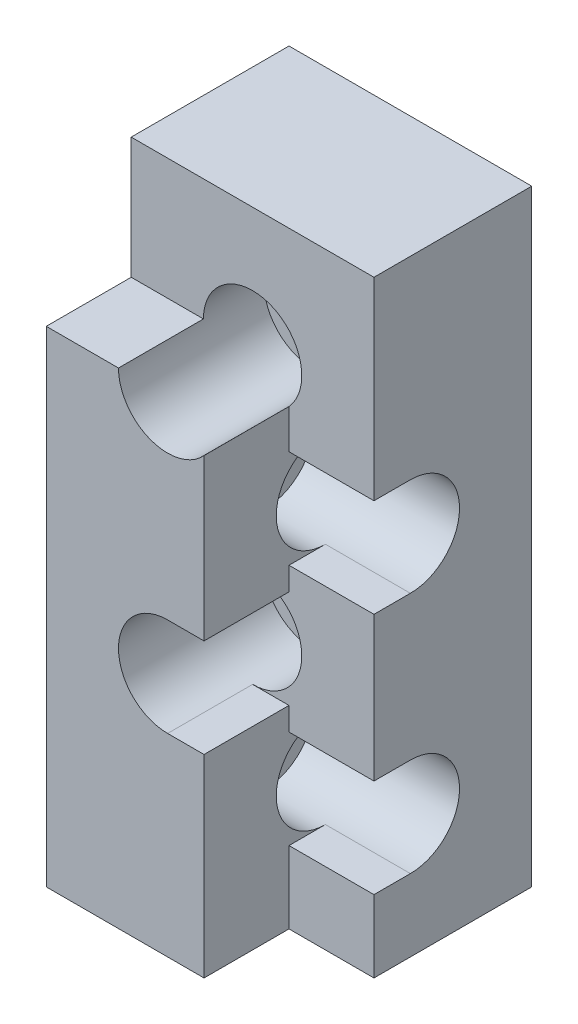
ISO-10303-21;
HEADER;
FILE_DESCRIPTION(('STEP AP214'),'2;1');
FILE_NAME('part.step','',(''),(''),'','','');
FILE_SCHEMA(('AUTOMOTIVE_DESIGN { 1 0 10303 214 1 1 1 1 }'));
ENDSEC;
DATA;
#1=APPLICATION_CONTEXT('core data for automotive mechanical design processes');
#2=APPLICATION_PROTOCOL_DEFINITION('international standard','automotive_design',2000,#1);
#3=PRODUCT_CONTEXT('',#1,'mechanical');
#4=PRODUCT('Part','Part','',(#3));
#5=PRODUCT_RELATED_PRODUCT_CATEGORY('part','',(#4));
#6=PRODUCT_DEFINITION_FORMATION('','',#4);
#7=PRODUCT_DEFINITION_CONTEXT('part definition',#1,'design');
#8=PRODUCT_DEFINITION('design','',#6,#7);
#9=PRODUCT_DEFINITION_SHAPE('','',#8);
#10=(LENGTH_UNIT() NAMED_UNIT(*) SI_UNIT(.MILLI.,.METRE.));
#11=(NAMED_UNIT(*) PLANE_ANGLE_UNIT() SI_UNIT($,.RADIAN.));
#12=(NAMED_UNIT(*) SI_UNIT($,.STERADIAN.) SOLID_ANGLE_UNIT());
#13=UNCERTAINTY_MEASURE_WITH_UNIT(LENGTH_MEASURE(1.E-05),#10,'distance_accuracy_value','');
#14=(GEOMETRIC_REPRESENTATION_CONTEXT(3) GLOBAL_UNCERTAINTY_ASSIGNED_CONTEXT((#13)) GLOBAL_UNIT_ASSIGNED_CONTEXT((#10,
#11,#12)) REPRESENTATION_CONTEXT('',''));
#15=CARTESIAN_POINT('',(0.,0.,0.));
#16=DIRECTION('',(0.,0.,1.));
#17=DIRECTION('',(1.,0.,0.));
#18=AXIS2_PLACEMENT_3D('',#15,#16,#17);
#19=CARTESIAN_POINT('',(20.,30.,-10.));
#20=DIRECTION('',(-1.,0.,0.));
#21=DIRECTION('',(0.,0.,1.));
#22=AXIS2_PLACEMENT_3D('',#19,#20,#21);
#23=CYLINDRICAL_SURFACE('',#22,4.05);
#24=CARTESIAN_POINT('',(8.,30.,-10.));
#25=DIRECTION('',(1.,0.,0.));
#26=DIRECTION('',(0.,0.,-1.));
#27=AXIS2_PLACEMENT_3D('',#24,#25,#26);
#28=CIRCLE('',#27,4.05);
#29=CARTESIAN_POINT('',(8.,30.,-14.05));
#30=VERTEX_POINT('',#29);
#31=EDGE_CURVE('E217',#30,#30,#28,.T.);
#32=ORIENTED_EDGE('',*,*,#31,.F.);
#33=EDGE_LOOP('',(#32));
#34=FACE_BOUND('',#33,.T.);
#35=CARTESIAN_POINT('',(20.,30.,-10.));
#36=DIRECTION('',(-1.,0.,0.));
#37=DIRECTION('',(0.,0.,1.));
#38=AXIS2_PLACEMENT_3D('',#35,#36,#37);
#39=CIRCLE('',#38,4.05);
#40=CARTESIAN_POINT('',(20.,25.95,-10.));
#41=VERTEX_POINT('',#40);
#42=CARTESIAN_POINT('',(20.,34.05,-10.));
#43=VERTEX_POINT('',#42);
#44=EDGE_CURVE('E11',#41,#43,#39,.F.);
#45=ORIENTED_EDGE('',*,*,#44,.T.);
#46=DIRECTION('',(1.,0.,0.));
#47=VECTOR('',#46,1.);
#48=CARTESIAN_POINT('',(13.,34.05,-10.));
#49=LINE('',#48,#47);
#50=CARTESIAN_POINT('',(13.,34.05,-10.));
#51=VERTEX_POINT('',#50);
#52=EDGE_CURVE('E448',#51,#43,#49,.T.);
#53=ORIENTED_EDGE('',*,*,#52,.F.);
#54=CARTESIAN_POINT('',(13.,30.,-10.));
#55=DIRECTION('',(-1.,0.,0.));
#56=DIRECTION('',(0.,0.,1.));
#57=AXIS2_PLACEMENT_3D('',#54,#55,#56);
#58=CIRCLE('',#57,4.05);
#59=CARTESIAN_POINT('',(13.,25.95,-10.));
#60=VERTEX_POINT('',#59);
#61=EDGE_CURVE('E63',#51,#60,#58,.F.);
#62=ORIENTED_EDGE('',*,*,#61,.T.);
#63=DIRECTION('',(1.,0.,0.));
#64=VECTOR('',#63,1.);
#65=CARTESIAN_POINT('',(13.,25.95,-10.));
#66=LINE('',#65,#64);
#67=EDGE_CURVE('E460',#60,#41,#66,.T.);
#68=ORIENTED_EDGE('',*,*,#67,.T.);
#69=EDGE_LOOP('',(#45,#53,#62,#68));
#70=FACE_BOUND('',#69,.T.);
#71=ADVANCED_FACE('F37',(#34,#70),#23,.F.);
#72=CARTESIAN_POINT('',(20.,10.,-10.));
#73=DIRECTION('',(-1.,0.,0.));
#74=DIRECTION('',(0.,0.,1.));
#75=AXIS2_PLACEMENT_3D('',#72,#73,#74);
#76=CYLINDRICAL_SURFACE('',#75,4.05);
#77=CARTESIAN_POINT('',(8.,10.,-10.));
#78=DIRECTION('',(1.,0.,0.));
#79=DIRECTION('',(0.,0.,-1.));
#80=AXIS2_PLACEMENT_3D('',#77,#78,#79);
#81=CIRCLE('',#80,4.05);
#82=CARTESIAN_POINT('',(8.,10.,-14.05));
#83=VERTEX_POINT('',#82);
#84=EDGE_CURVE('E245',#83,#83,#81,.T.);
#85=ORIENTED_EDGE('',*,*,#84,.F.);
#86=EDGE_LOOP('',(#85));
#87=FACE_BOUND('',#86,.T.);
#88=CARTESIAN_POINT('',(20.,10.,-10.));
#89=DIRECTION('',(-1.,0.,0.));
#90=DIRECTION('',(0.,0.,1.));
#91=AXIS2_PLACEMENT_3D('',#88,#89,#90);
#92=CIRCLE('',#91,4.05);
#93=CARTESIAN_POINT('',(20.,5.95,-10.));
#94=VERTEX_POINT('',#93);
#95=CARTESIAN_POINT('',(20.,14.05,-10.));
#96=VERTEX_POINT('',#95);
#97=EDGE_CURVE('E47',#94,#96,#92,.F.);
#98=ORIENTED_EDGE('',*,*,#97,.T.);
#99=DIRECTION('',(1.,0.,0.));
#100=VECTOR('',#99,1.);
#101=CARTESIAN_POINT('',(13.,14.05,-10.));
#102=LINE('',#101,#100);
#103=CARTESIAN_POINT('',(13.,14.05,-10.));
#104=VERTEX_POINT('',#103);
#105=EDGE_CURVE('E443',#104,#96,#102,.T.);
#106=ORIENTED_EDGE('',*,*,#105,.F.);
#107=CARTESIAN_POINT('',(13.,10.,-10.));
#108=DIRECTION('',(-1.,0.,0.));
#109=DIRECTION('',(0.,0.,1.));
#110=AXIS2_PLACEMENT_3D('',#107,#108,#109);
#111=CIRCLE('',#110,4.05);
#112=CARTESIAN_POINT('',(13.,5.95,-10.));
#113=VERTEX_POINT('',#112);
#114=EDGE_CURVE('E220',#104,#113,#111,.F.);
#115=ORIENTED_EDGE('',*,*,#114,.T.);
#116=DIRECTION('',(1.,0.,0.));
#117=VECTOR('',#116,1.);
#118=CARTESIAN_POINT('',(13.,5.95,-10.));
#119=LINE('',#118,#117);
#120=EDGE_CURVE('E453',#113,#94,#119,.T.);
#121=ORIENTED_EDGE('',*,*,#120,.T.);
#122=EDGE_LOOP('',(#98,#106,#115,#121));
#123=FACE_BOUND('',#122,.T.);
#124=ADVANCED_FACE('F525',(#87,#123),#76,.F.);
#125=CARTESIAN_POINT('',(10.,20.,0.));
#126=DIRECTION('',(0.,0.,-1.));
#127=DIRECTION('',(-1.,0.,0.));
#128=AXIS2_PLACEMENT_3D('',#125,#126,#127);
#129=CYLINDRICAL_SURFACE('',#128,4.05);
#130=CARTESIAN_POINT('',(10.,20.,-12.));
#131=DIRECTION('',(0.,0.,-1.));
#132=DIRECTION('',(-1.,0.,0.));
#133=AXIS2_PLACEMENT_3D('',#130,#131,#132);
#134=CIRCLE('',#133,4.05);
#135=CARTESIAN_POINT('',(5.95,20.,-12.));
#136=VERTEX_POINT('',#135);
#137=EDGE_CURVE('E232',#136,#136,#134,.T.);
#138=ORIENTED_EDGE('',*,*,#137,.T.);
#139=EDGE_LOOP('',(#138));
#140=FACE_BOUND('',#139,.T.);
#141=CARTESIAN_POINT('',(10.,20.,-7.));
#142=DIRECTION('',(0.,0.,-1.));
#143=DIRECTION('',(-1.,0.,0.));
#144=AXIS2_PLACEMENT_3D('',#141,#142,#143);
#145=CIRCLE('',#144,4.05);
#146=CARTESIAN_POINT('',(10.,24.05,-7.));
#147=VERTEX_POINT('',#146);
#148=CARTESIAN_POINT('',(10.,15.95,-7.));
#149=VERTEX_POINT('',#148);
#150=EDGE_CURVE('E224',#147,#149,#145,.T.);
#151=ORIENTED_EDGE('',*,*,#150,.F.);
#152=DIRECTION('',(0.,0.,1.));
#153=VECTOR('',#152,1.);
#154=CARTESIAN_POINT('',(10.,24.05,-7.));
#155=LINE('',#154,#153);
#156=CARTESIAN_POINT('',(10.,24.05,0.));
#157=VERTEX_POINT('',#156);
#158=EDGE_CURVE('E403',#147,#157,#155,.T.);
#159=ORIENTED_EDGE('',*,*,#158,.T.);
#160=CARTESIAN_POINT('',(10.,20.,0.));
#161=DIRECTION('',(0.,0.,-1.));
#162=DIRECTION('',(-1.,0.,0.));
#163=AXIS2_PLACEMENT_3D('',#160,#161,#162);
#164=CIRCLE('',#163,4.05);
#165=CARTESIAN_POINT('',(10.,15.95,0.));
#166=VERTEX_POINT('',#165);
#167=EDGE_CURVE('E225',#166,#157,#164,.T.);
#168=ORIENTED_EDGE('',*,*,#167,.F.);
#169=DIRECTION('',(0.,0.,1.));
#170=VECTOR('',#169,1.);
#171=CARTESIAN_POINT('',(10.,15.95,-7.));
#172=LINE('',#171,#170);
#173=EDGE_CURVE('E398',#149,#166,#172,.T.);
#174=ORIENTED_EDGE('',*,*,#173,.F.);
#175=EDGE_LOOP('',(#151,#159,#168,#174));
#176=FACE_BOUND('',#175,.T.);
#177=ADVANCED_FACE('F531',(#140,#176),#129,.F.);
#178=CARTESIAN_POINT('',(13.,40.,-7.));
#179=DIRECTION('',(-1.,0.,0.));
#180=DIRECTION('',(0.,0.,1.));
#181=AXIS2_PLACEMENT_3D('',#178,#179,#180);
#182=PLANE('',#181);
#183=DIRECTION('',(0.,-1.,0.));
#184=VECTOR('',#183,1.);
#185=CARTESIAN_POINT('',(13.,40.,-7.));
#186=LINE('',#185,#184);
#187=CARTESIAN_POINT('',(13.,37.2792464279174,-7.));
#188=VERTEX_POINT('',#187);
#189=CARTESIAN_POINT('',(13.,34.05,-7.));
#190=VERTEX_POINT('',#189);
#191=EDGE_CURVE('E194',#188,#190,#186,.T.);
#192=ORIENTED_EDGE('',*,*,#191,.F.);
#193=DIRECTION('',(0.,0.,-1.));
#194=VECTOR('',#193,1.);
#195=CARTESIAN_POINT('',(13.,37.2792464279174,0.));
#196=LINE('',#195,#194);
#197=CARTESIAN_POINT('',(13.,37.2792464279174,0.));
#198=VERTEX_POINT('',#197);
#199=EDGE_CURVE('E178',#188,#198,#196,.F.);
#200=ORIENTED_EDGE('',*,*,#199,.T.);
#201=DIRECTION('',(0.,-1.,0.));
#202=VECTOR('',#201,1.);
#203=CARTESIAN_POINT('',(13.,40.,0.));
#204=LINE('',#203,#202);
#205=CARTESIAN_POINT('',(13.,24.05,0.));
#206=VERTEX_POINT('',#205);
#207=EDGE_CURVE('E191',#198,#206,#204,.T.);
#208=ORIENTED_EDGE('',*,*,#207,.T.);
#209=DIRECTION('',(0.,0.,-1.));
#210=VECTOR('',#209,1.);
#211=CARTESIAN_POINT('',(13.,24.05,-7.));
#212=LINE('',#211,#210);
#213=CARTESIAN_POINT('',(13.,24.05,-7.));
#214=VERTEX_POINT('',#213);
#215=EDGE_CURVE('E238',#206,#214,#212,.T.);
#216=ORIENTED_EDGE('',*,*,#215,.T.);
#217=CARTESIAN_POINT('',(13.,25.95,-7.));
#218=VERTEX_POINT('',#217);
#219=EDGE_CURVE('E337',#218,#214,#186,.T.);
#220=ORIENTED_EDGE('',*,*,#219,.F.);
#221=DIRECTION('',(0.,0.,-1.));
#222=VECTOR('',#221,1.);
#223=CARTESIAN_POINT('',(13.,25.95,0.));
#224=LINE('',#223,#222);
#225=EDGE_CURVE('E463',#218,#60,#224,.T.);
#226=ORIENTED_EDGE('',*,*,#225,.T.);
#227=ORIENTED_EDGE('',*,*,#61,.F.);
#228=DIRECTION('',(0.,0.,1.));
#229=VECTOR('',#228,1.);
#230=CARTESIAN_POINT('',(13.,34.05,-10.));
#231=LINE('',#230,#229);
#232=EDGE_CURVE('E468',#51,#190,#231,.T.);
#233=ORIENTED_EDGE('',*,*,#232,.T.);
#234=EDGE_LOOP('',(#192,#200,#208,#216,#220,#226,#227,#233));
#235=FACE_BOUND('',#234,.T.);
#236=ADVANCED_FACE('F189',(#235),#182,.F.);
#237=CARTESIAN_POINT('',(20.,40.,-7.));
#238=DIRECTION('',(0.,0.,-1.));
#239=DIRECTION('',(-1.,0.,0.));
#240=AXIS2_PLACEMENT_3D('',#237,#238,#239);
#241=PLANE('',#240);
#242=DIRECTION('',(0.,-1.,0.));
#243=VECTOR('',#242,1.);
#244=CARTESIAN_POINT('',(20.,40.,-7.));
#245=LINE('',#244,#243);
#246=CARTESIAN_POINT('',(20.,25.95,-7.));
#247=VERTEX_POINT('',#246);
#248=CARTESIAN_POINT('',(20.,14.05,-7.));
#249=VERTEX_POINT('',#248);
#250=EDGE_CURVE('E330',#247,#249,#245,.T.);
#251=ORIENTED_EDGE('',*,*,#250,.F.);
#252=DIRECTION('',(-1.,0.,0.));
#253=VECTOR('',#252,1.);
#254=CARTESIAN_POINT('',(20.,25.95,-7.));
#255=LINE('',#254,#253);
#256=EDGE_CURVE('E378',#247,#218,#255,.T.);
#257=ORIENTED_EDGE('',*,*,#256,.T.);
#258=ORIENTED_EDGE('',*,*,#219,.T.);
#259=DIRECTION('',(-1.,0.,0.));
#260=VECTOR('',#259,1.);
#261=CARTESIAN_POINT('',(10.,24.05,-7.));
#262=LINE('',#261,#260);
#263=EDGE_CURVE('E394',#214,#147,#262,.T.);
#264=ORIENTED_EDGE('',*,*,#263,.T.);
#265=ORIENTED_EDGE('',*,*,#150,.T.);
#266=DIRECTION('',(1.,0.,0.));
#267=VECTOR('',#266,1.);
#268=CARTESIAN_POINT('',(18.,15.95,-7.));
#269=LINE('',#268,#267);
#270=CARTESIAN_POINT('',(13.,15.95,-7.));
#271=VERTEX_POINT('',#270);
#272=EDGE_CURVE('E390',#149,#271,#269,.T.);
#273=ORIENTED_EDGE('',*,*,#272,.T.);
#274=CARTESIAN_POINT('',(13.,14.05,-7.));
#275=VERTEX_POINT('',#274);
#276=EDGE_CURVE('E336',#271,#275,#186,.T.);
#277=ORIENTED_EDGE('',*,*,#276,.T.);
#278=DIRECTION('',(1.,0.,0.));
#279=VECTOR('',#278,1.);
#280=CARTESIAN_POINT('',(20.,14.05,-7.));
#281=LINE('',#280,#279);
#282=EDGE_CURVE('E386',#275,#249,#281,.T.);
#283=ORIENTED_EDGE('',*,*,#282,.T.);
#284=EDGE_LOOP('',(#251,#257,#258,#264,#265,#273,#277,#283));
#285=FACE_BOUND('',#284,.T.);
#286=ADVANCED_FACE('F421',(#285),#241,.F.);
#287=DIRECTION('',(1.,0.,0.));
#288=VECTOR('',#287,1.);
#289=CARTESIAN_POINT('',(20.,40.,-7.));
#290=LINE('',#289,#288);
#291=CARTESIAN_POINT('',(0.,40.,-7.));
#292=VERTEX_POINT('',#291);
#293=CARTESIAN_POINT('',(5.95,40.,-7.));
#294=VERTEX_POINT('',#293);
#295=EDGE_CURVE('E261',#292,#294,#290,.T.);
#296=ORIENTED_EDGE('',*,*,#295,.T.);
#297=CARTESIAN_POINT('',(9.99999999999999,40.,-7.));
#298=DIRECTION('',(0.,0.,-1.));
#299=DIRECTION('',(-1.,0.,0.));
#300=AXIS2_PLACEMENT_3D('',#297,#298,#299);
#301=CIRCLE('',#300,4.05);
#302=EDGE_CURVE('E197',#294,#188,#301,.T.);
#303=ORIENTED_EDGE('',*,*,#302,.T.);
#304=ORIENTED_EDGE('',*,*,#191,.T.);
#305=DIRECTION('',(1.,0.,0.));
#306=VECTOR('',#305,1.);
#307=CARTESIAN_POINT('',(20.,34.05,-7.));
#308=LINE('',#307,#306);
#309=CARTESIAN_POINT('',(20.,34.05,-7.));
#310=VERTEX_POINT('',#309);
#311=EDGE_CURVE('E374',#190,#310,#308,.T.);
#312=ORIENTED_EDGE('',*,*,#311,.T.);
#313=CARTESIAN_POINT('',(20.,50.,-7.));
#314=VERTEX_POINT('',#313);
#315=EDGE_CURVE('E326',#314,#310,#245,.T.);
#316=ORIENTED_EDGE('',*,*,#315,.F.);
#317=DIRECTION('',(1.,0.,0.));
#318=VECTOR('',#317,1.);
#319=CARTESIAN_POINT('',(20.,50.,-7.));
#320=LINE('',#319,#318);
#321=CARTESIAN_POINT('',(0.,50.,-7.));
#322=VERTEX_POINT('',#321);
#323=EDGE_CURVE('E276',#322,#314,#320,.T.);
#324=ORIENTED_EDGE('',*,*,#323,.F.);
#325=DIRECTION('',(0.,-1.,0.));
#326=VECTOR('',#325,1.);
#327=CARTESIAN_POINT('',(0.,50.,-7.));
#328=LINE('',#327,#326);
#329=EDGE_CURVE('E280',#322,#292,#328,.T.);
#330=ORIENTED_EDGE('',*,*,#329,.T.);
#331=EDGE_LOOP('',(#296,#303,#304,#312,#316,#324,#330));
#332=FACE_BOUND('',#331,.T.);
#333=ADVANCED_FACE('F371',(#332),#241,.F.);
#334=CARTESIAN_POINT('',(20.,5.95,-7.));
#335=VERTEX_POINT('',#334);
#336=CARTESIAN_POINT('',(20.,0.,-7.));
#337=VERTEX_POINT('',#336);
#338=EDGE_CURVE('E325',#335,#337,#245,.T.);
#339=ORIENTED_EDGE('',*,*,#338,.F.);
#340=DIRECTION('',(-1.,0.,0.));
#341=VECTOR('',#340,1.);
#342=CARTESIAN_POINT('',(20.,5.95,-7.));
#343=LINE('',#342,#341);
#344=CARTESIAN_POINT('',(13.,5.95,-7.));
#345=VERTEX_POINT('',#344);
#346=EDGE_CURVE('E379',#335,#345,#343,.T.);
#347=ORIENTED_EDGE('',*,*,#346,.T.);
#348=CARTESIAN_POINT('',(13.,0.,-7.));
#349=VERTEX_POINT('',#348);
#350=EDGE_CURVE('E329',#345,#349,#186,.T.);
#351=ORIENTED_EDGE('',*,*,#350,.T.);
#352=DIRECTION('',(1.,0.,0.));
#353=VECTOR('',#352,1.);
#354=CARTESIAN_POINT('',(20.,0.,-7.));
#355=LINE('',#354,#353);
#356=EDGE_CURVE('E303',#349,#337,#355,.T.);
#357=ORIENTED_EDGE('',*,*,#356,.T.);
#358=EDGE_LOOP('',(#339,#347,#351,#357));
#359=FACE_BOUND('',#358,.T.);
#360=ADVANCED_FACE('F350',(#359),#241,.F.);
#361=CARTESIAN_POINT('',(0.,10.,-10.));
#362=DIRECTION('',(1.,0.,0.));
#363=DIRECTION('',(0.,0.,-1.));
#364=AXIS2_PLACEMENT_3D('',#361,#362,#363);
#365=CYLINDRICAL_SURFACE('',#364,2.125);
#366=CARTESIAN_POINT('',(0.,10.,-10.));
#367=DIRECTION('',(1.,0.,0.));
#368=DIRECTION('',(0.,0.,-1.));
#369=AXIS2_PLACEMENT_3D('',#366,#367,#368);
#370=CIRCLE('',#369,2.125);
#371=CARTESIAN_POINT('',(0.,10.,-12.125));
#372=VERTEX_POINT('',#371);
#373=EDGE_CURVE('E256',#372,#372,#370,.T.);
#374=CARTESIAN_POINT('',(8.,10.,-10.));
#375=DIRECTION('',(1.,0.,0.));
#376=DIRECTION('',(0.,0.,-1.));
#377=AXIS2_PLACEMENT_3D('',#374,#375,#376);
#378=CIRCLE('',#377,2.125);
#379=CARTESIAN_POINT('',(8.,10.,-12.125));
#380=VERTEX_POINT('',#379);
#381=EDGE_CURVE('E216',#380,#380,#378,.F.);
#382=CARTESIAN_POINT('',(0.,10.,-12.125));
#383=CARTESIAN_POINT('',(0.0833333333333314,10.,-12.125));
#384=CARTESIAN_POINT('',(0.166666666666665,10.,-12.125));
#385=CARTESIAN_POINT('',(0.333333333333331,10.,-12.125));
#386=CARTESIAN_POINT('',(0.416666666666665,10.,-12.125));
#387=CARTESIAN_POINT('',(0.583333333333331,10.,-12.125));
#388=CARTESIAN_POINT('',(0.666666666666665,10.,-12.125));
#389=CARTESIAN_POINT('',(0.833333333333331,10.,-12.125));
#390=CARTESIAN_POINT('',(0.916666666666665,10.,-12.125));
#391=CARTESIAN_POINT('',(1.08333333333333,10.,-12.125));
#392=CARTESIAN_POINT('',(1.16666666666666,10.,-12.125));
#393=CARTESIAN_POINT('',(1.33333333333333,10.,-12.125));
#394=CARTESIAN_POINT('',(1.41666666666666,10.,-12.125));
#395=CARTESIAN_POINT('',(1.58333333333333,10.,-12.125));
#396=CARTESIAN_POINT('',(1.66666666666666,10.,-12.125));
#397=CARTESIAN_POINT('',(1.83333333333333,10.,-12.125));
#398=CARTESIAN_POINT('',(1.91666666666666,10.,-12.125));
#399=CARTESIAN_POINT('',(2.08333333333333,10.,-12.125));
#400=CARTESIAN_POINT('',(2.16666666666666,10.,-12.125));
#401=CARTESIAN_POINT('',(2.33333333333333,10.,-12.125));
#402=CARTESIAN_POINT('',(2.41666666666666,10.,-12.125));
#403=CARTESIAN_POINT('',(2.58333333333333,10.,-12.125));
#404=CARTESIAN_POINT('',(2.66666666666666,10.,-12.125));
#405=CARTESIAN_POINT('',(2.83333333333333,10.,-12.125));
#406=CARTESIAN_POINT('',(2.91666666666666,10.,-12.125));
#407=CARTESIAN_POINT('',(3.08333333333333,10.,-12.125));
#408=CARTESIAN_POINT('',(3.16666666666666,10.,-12.125));
#409=CARTESIAN_POINT('',(3.33333333333333,10.,-12.125));
#410=CARTESIAN_POINT('',(3.41666666666666,10.,-12.125));
#411=CARTESIAN_POINT('',(3.58333333333333,10.,-12.125));
#412=CARTESIAN_POINT('',(3.66666666666666,10.,-12.125));
#413=CARTESIAN_POINT('',(3.83333333333333,10.,-12.125));
#414=CARTESIAN_POINT('',(3.91666666666666,10.,-12.125));
#415=CARTESIAN_POINT('',(4.08333333333333,10.,-12.125));
#416=CARTESIAN_POINT('',(4.16666666666666,10.,-12.125));
#417=CARTESIAN_POINT('',(4.33333333333333,10.,-12.125));
#418=CARTESIAN_POINT('',(4.41666666666666,10.,-12.125));
#419=CARTESIAN_POINT('',(4.58333333333333,10.,-12.125));
#420=CARTESIAN_POINT('',(4.66666666666666,10.,-12.125));
#421=CARTESIAN_POINT('',(4.83333333333333,10.,-12.125));
#422=CARTESIAN_POINT('',(4.91666666666666,10.,-12.125));
#423=CARTESIAN_POINT('',(5.08333333333333,10.,-12.125));
#424=CARTESIAN_POINT('',(5.16666666666666,10.,-12.125));
#425=CARTESIAN_POINT('',(5.33333333333333,10.,-12.125));
#426=CARTESIAN_POINT('',(5.41666666666666,10.,-12.125));
#427=CARTESIAN_POINT('',(5.58333333333333,10.,-12.125));
#428=CARTESIAN_POINT('',(5.66666666666666,10.,-12.125));
#429=CARTESIAN_POINT('',(5.83333333333333,10.,-12.125));
#430=CARTESIAN_POINT('',(5.91666666666666,10.,-12.125));
#431=CARTESIAN_POINT('',(6.08333333333333,10.,-12.125));
#432=CARTESIAN_POINT('',(6.16666666666666,10.,-12.125));
#433=CARTESIAN_POINT('',(6.33333333333333,10.,-12.125));
#434=CARTESIAN_POINT('',(6.41666666666666,10.,-12.125));
#435=CARTESIAN_POINT('',(6.58333333333333,10.,-12.125));
#436=CARTESIAN_POINT('',(6.66666666666666,10.,-12.125));
#437=CARTESIAN_POINT('',(6.83333333333333,10.,-12.125));
#438=CARTESIAN_POINT('',(6.91666666666666,10.,-12.125));
#439=CARTESIAN_POINT('',(7.08333333333333,10.,-12.125));
#440=CARTESIAN_POINT('',(7.16666666666666,10.,-12.125));
#441=CARTESIAN_POINT('',(7.33333333333333,10.,-12.125));
#442=CARTESIAN_POINT('',(7.41666666666666,10.,-12.125));
#443=CARTESIAN_POINT('',(7.58333333333333,10.,-12.125));
#444=CARTESIAN_POINT('',(7.66666666666666,10.,-12.125));
#445=CARTESIAN_POINT('',(7.83333333333333,10.,-12.125));
#446=CARTESIAN_POINT('',(7.91666666666666,10.,-12.125));
#447=CARTESIAN_POINT('',(8.,10.,-12.125));
#448=B_SPLINE_CURVE_WITH_KNOTS('',3,(#382,#383,#384,#385,#386,#387,#388,#389,#390,#391,#392,
#393,#394,#395,#396,#397,#398,#399,#400,#401,#402,#403,#404,#405,#406,#407,#408,#409,#410,#411,
#412,#413,#414,#415,#416,#417,#418,#419,#420,#421,#422,#423,#424,#425,#426,#427,#428,#429,#430,
#431,#432,#433,#434,#435,#436,#437,#438,#439,#440,#441,#442,#443,#444,#445,#446,#447),
.UNSPECIFIED.,.F.,.F.,(4,2,2,2,2,2,2,2,2,2,2,2,2,2,2,2,2,2,2,2,2,2,2,2,2,2,2,2,2,2,2,2,4),(0.,
0.25,0.5,0.75,1.,1.25,1.5,1.75,2.,2.25,2.5,2.75,3.,3.25,3.5,3.75,4.,4.25,4.5,4.75,5.,5.25,5.5,
5.75,6.,6.25,6.5,6.75,7.,7.25,7.5,7.75,8.),.UNSPECIFIED.);
#449=EDGE_CURVE('BSEAM540',#372,#380,#448,.T.);
#450=ORIENTED_EDGE('',*,*,#373,.F.);
#451=ORIENTED_EDGE('',*,*,#381,.F.);
#452=ORIENTED_EDGE('',*,*,#449,.T.);
#453=ORIENTED_EDGE('',*,*,#449,.F.);
#454=EDGE_LOOP('',(#450,#452,#451,#453));
#455=FACE_BOUND('',#454,.T.);
#456=ADVANCED_FACE('F540',(#455),#365,.F.);
#457=CARTESIAN_POINT('',(0.,30.,-10.));
#458=DIRECTION('',(1.,0.,0.));
#459=DIRECTION('',(0.,0.,-1.));
#460=AXIS2_PLACEMENT_3D('',#457,#458,#459);
#461=CYLINDRICAL_SURFACE('',#460,2.125);
#462=CARTESIAN_POINT('',(0.,30.,-10.));
#463=DIRECTION('',(1.,0.,0.));
#464=DIRECTION('',(0.,0.,-1.));
#465=AXIS2_PLACEMENT_3D('',#462,#463,#464);
#466=CIRCLE('',#465,2.125);
#467=CARTESIAN_POINT('',(0.,30.,-12.125));
#468=VERTEX_POINT('',#467);
#469=EDGE_CURVE('E257',#468,#468,#466,.T.);
#470=CARTESIAN_POINT('',(8.,30.,-10.));
#471=DIRECTION('',(1.,0.,0.));
#472=DIRECTION('',(0.,0.,-1.));
#473=AXIS2_PLACEMENT_3D('',#470,#471,#472);
#474=CIRCLE('',#473,2.125);
#475=CARTESIAN_POINT('',(8.,30.,-12.125));
#476=VERTEX_POINT('',#475);
#477=EDGE_CURVE('E212',#476,#476,#474,.F.);
#478=CARTESIAN_POINT('',(0.,30.,-12.125));
#479=CARTESIAN_POINT('',(0.0833333333333314,30.,-12.125));
#480=CARTESIAN_POINT('',(0.166666666666665,30.,-12.125));
#481=CARTESIAN_POINT('',(0.333333333333331,30.,-12.125));
#482=CARTESIAN_POINT('',(0.416666666666665,30.,-12.125));
#483=CARTESIAN_POINT('',(0.583333333333331,30.,-12.125));
#484=CARTESIAN_POINT('',(0.666666666666665,30.,-12.125));
#485=CARTESIAN_POINT('',(0.833333333333331,30.,-12.125));
#486=CARTESIAN_POINT('',(0.916666666666665,30.,-12.125));
#487=CARTESIAN_POINT('',(1.08333333333333,30.,-12.125));
#488=CARTESIAN_POINT('',(1.16666666666666,30.,-12.125));
#489=CARTESIAN_POINT('',(1.33333333333333,30.,-12.125));
#490=CARTESIAN_POINT('',(1.41666666666666,30.,-12.125));
#491=CARTESIAN_POINT('',(1.58333333333333,30.,-12.125));
#492=CARTESIAN_POINT('',(1.66666666666666,30.,-12.125));
#493=CARTESIAN_POINT('',(1.83333333333333,30.,-12.125));
#494=CARTESIAN_POINT('',(1.91666666666666,30.,-12.125));
#495=CARTESIAN_POINT('',(2.08333333333333,30.,-12.125));
#496=CARTESIAN_POINT('',(2.16666666666666,30.,-12.125));
#497=CARTESIAN_POINT('',(2.33333333333333,30.,-12.125));
#498=CARTESIAN_POINT('',(2.41666666666666,30.,-12.125));
#499=CARTESIAN_POINT('',(2.58333333333333,30.,-12.125));
#500=CARTESIAN_POINT('',(2.66666666666666,30.,-12.125));
#501=CARTESIAN_POINT('',(2.83333333333333,30.,-12.125));
#502=CARTESIAN_POINT('',(2.91666666666666,30.,-12.125));
#503=CARTESIAN_POINT('',(3.08333333333333,30.,-12.125));
#504=CARTESIAN_POINT('',(3.16666666666666,30.,-12.125));
#505=CARTESIAN_POINT('',(3.33333333333333,30.,-12.125));
#506=CARTESIAN_POINT('',(3.41666666666666,30.,-12.125));
#507=CARTESIAN_POINT('',(3.58333333333333,30.,-12.125));
#508=CARTESIAN_POINT('',(3.66666666666666,30.,-12.125));
#509=CARTESIAN_POINT('',(3.83333333333333,30.,-12.125));
#510=CARTESIAN_POINT('',(3.91666666666666,30.,-12.125));
#511=CARTESIAN_POINT('',(4.08333333333333,30.,-12.125));
#512=CARTESIAN_POINT('',(4.16666666666666,30.,-12.125));
#513=CARTESIAN_POINT('',(4.33333333333333,30.,-12.125));
#514=CARTESIAN_POINT('',(4.41666666666666,30.,-12.125));
#515=CARTESIAN_POINT('',(4.58333333333333,30.,-12.125));
#516=CARTESIAN_POINT('',(4.66666666666666,30.,-12.125));
#517=CARTESIAN_POINT('',(4.83333333333333,30.,-12.125));
#518=CARTESIAN_POINT('',(4.91666666666666,30.,-12.125));
#519=CARTESIAN_POINT('',(5.08333333333333,30.,-12.125));
#520=CARTESIAN_POINT('',(5.16666666666666,30.,-12.125));
#521=CARTESIAN_POINT('',(5.33333333333333,30.,-12.125));
#522=CARTESIAN_POINT('',(5.41666666666666,30.,-12.125));
#523=CARTESIAN_POINT('',(5.58333333333333,30.,-12.125));
#524=CARTESIAN_POINT('',(5.66666666666666,30.,-12.125));
#525=CARTESIAN_POINT('',(5.83333333333333,30.,-12.125));
#526=CARTESIAN_POINT('',(5.91666666666666,30.,-12.125));
#527=CARTESIAN_POINT('',(6.08333333333333,30.,-12.125));
#528=CARTESIAN_POINT('',(6.16666666666666,30.,-12.125));
#529=CARTESIAN_POINT('',(6.33333333333333,30.,-12.125));
#530=CARTESIAN_POINT('',(6.41666666666666,30.,-12.125));
#531=CARTESIAN_POINT('',(6.58333333333333,30.,-12.125));
#532=CARTESIAN_POINT('',(6.66666666666666,30.,-12.125));
#533=CARTESIAN_POINT('',(6.83333333333333,30.,-12.125));
#534=CARTESIAN_POINT('',(6.91666666666666,30.,-12.125));
#535=CARTESIAN_POINT('',(7.08333333333333,30.,-12.125));
#536=CARTESIAN_POINT('',(7.16666666666666,30.,-12.125));
#537=CARTESIAN_POINT('',(7.33333333333333,30.,-12.125));
#538=CARTESIAN_POINT('',(7.41666666666666,30.,-12.125));
#539=CARTESIAN_POINT('',(7.58333333333333,30.,-12.125));
#540=CARTESIAN_POINT('',(7.66666666666666,30.,-12.125));
#541=CARTESIAN_POINT('',(7.83333333333333,30.,-12.125));
#542=CARTESIAN_POINT('',(7.91666666666666,30.,-12.125));
#543=CARTESIAN_POINT('',(8.,30.,-12.125));
#544=B_SPLINE_CURVE_WITH_KNOTS('',3,(#478,#479,#480,#481,#482,#483,#484,#485,#486,#487,#488,
#489,#490,#491,#492,#493,#494,#495,#496,#497,#498,#499,#500,#501,#502,#503,#504,#505,#506,#507,
#508,#509,#510,#511,#512,#513,#514,#515,#516,#517,#518,#519,#520,#521,#522,#523,#524,#525,#526,
#527,#528,#529,#530,#531,#532,#533,#534,#535,#536,#537,#538,#539,#540,#541,#542,#543),
.UNSPECIFIED.,.F.,.F.,(4,2,2,2,2,2,2,2,2,2,2,2,2,2,2,2,2,2,2,2,2,2,2,2,2,2,2,2,2,2,2,2,4),(0.,
0.25,0.5,0.75,1.,1.25,1.5,1.75,2.,2.25,2.5,2.75,3.,3.25,3.5,3.75,4.,4.25,4.5,4.75,5.,5.25,5.5,
5.75,6.,6.25,6.5,6.75,7.,7.25,7.5,7.75,8.),.UNSPECIFIED.);
#545=EDGE_CURVE('BSEAM536',#468,#476,#544,.T.);
#546=ORIENTED_EDGE('',*,*,#469,.F.);
#547=ORIENTED_EDGE('',*,*,#477,.F.);
#548=ORIENTED_EDGE('',*,*,#545,.T.);
#549=ORIENTED_EDGE('',*,*,#545,.F.);
#550=EDGE_LOOP('',(#546,#548,#547,#549));
#551=FACE_BOUND('',#550,.T.);
#552=ADVANCED_FACE('F536',(#551),#461,.F.);
#553=CARTESIAN_POINT('',(0.,40.,0.));
#554=DIRECTION('',(0.,-1.,0.));
#555=DIRECTION('',(0.,0.,-1.));
#556=AXIS2_PLACEMENT_3D('',#553,#554,#555);
#557=PLANE('',#556);
#558=DIRECTION('',(1.,0.,0.));
#559=VECTOR('',#558,1.);
#560=CARTESIAN_POINT('',(13.,40.,0.));
#561=LINE('',#560,#559);
#562=CARTESIAN_POINT('',(0.,40.,0.));
#563=VERTEX_POINT('',#562);
#564=CARTESIAN_POINT('',(5.95,40.,0.));
#565=VERTEX_POINT('',#564);
#566=EDGE_CURVE('E288',#563,#565,#561,.T.);
#567=ORIENTED_EDGE('',*,*,#566,.T.);
#568=DIRECTION('',(0.,0.,-1.));
#569=VECTOR('',#568,1.);
#570=CARTESIAN_POINT('',(5.95,40.,0.));
#571=LINE('',#570,#569);
#572=EDGE_CURVE('E55',#565,#294,#571,.T.);
#573=ORIENTED_EDGE('',*,*,#572,.T.);
#574=ORIENTED_EDGE('',*,*,#295,.F.);
#575=DIRECTION('',(0.,0.,1.));
#576=VECTOR('',#575,1.);
#577=CARTESIAN_POINT('',(0.,40.,0.));
#578=LINE('',#577,#576);
#579=EDGE_CURVE('E291',#292,#563,#578,.T.);
#580=ORIENTED_EDGE('',*,*,#579,.T.);
#581=EDGE_LOOP('',(#567,#573,#574,#580));
#582=FACE_BOUND('',#581,.T.);
#583=ADVANCED_FACE('F539',(#582),#557,.F.);
#584=CARTESIAN_POINT('',(13.,40.,0.));
#585=DIRECTION('',(0.,0.,-1.));
#586=DIRECTION('',(-1.,0.,0.));
#587=AXIS2_PLACEMENT_3D('',#584,#585,#586);
#588=PLANE('',#587);
#589=ORIENTED_EDGE('',*,*,#207,.F.);
#590=CARTESIAN_POINT('',(9.99999999999999,40.,0.));
#591=DIRECTION('',(0.,0.,-1.));
#592=DIRECTION('',(-1.,0.,0.));
#593=AXIS2_PLACEMENT_3D('',#590,#591,#592);
#594=CIRCLE('',#593,4.05);
#595=EDGE_CURVE('E175',#198,#565,#594,.T.);
#596=ORIENTED_EDGE('',*,*,#595,.T.);
#597=ORIENTED_EDGE('',*,*,#566,.F.);
#598=DIRECTION('',(0.,-1.,0.));
#599=VECTOR('',#598,1.);
#600=CARTESIAN_POINT('',(0.,40.,0.));
#601=LINE('',#600,#599);
#602=CARTESIAN_POINT('',(0.,0.,0.));
#603=VERTEX_POINT('',#602);
#604=EDGE_CURVE('E295',#563,#603,#601,.T.);
#605=ORIENTED_EDGE('',*,*,#604,.T.);
#606=DIRECTION('',(1.,0.,0.));
#607=VECTOR('',#606,1.);
#608=CARTESIAN_POINT('',(13.,0.,0.));
#609=LINE('',#608,#607);
#610=CARTESIAN_POINT('',(13.,0.,0.));
#611=VERTEX_POINT('',#610);
#612=EDGE_CURVE('E287',#603,#611,#609,.T.);
#613=ORIENTED_EDGE('',*,*,#612,.T.);
#614=CARTESIAN_POINT('',(13.,15.95,0.));
#615=VERTEX_POINT('',#614);
#616=EDGE_CURVE('E203',#615,#611,#204,.T.);
#617=ORIENTED_EDGE('',*,*,#616,.F.);
#618=DIRECTION('',(1.,0.,0.));
#619=VECTOR('',#618,1.);
#620=CARTESIAN_POINT('',(18.,15.95,0.));
#621=LINE('',#620,#619);
#622=EDGE_CURVE('E384',#166,#615,#621,.T.);
#623=ORIENTED_EDGE('',*,*,#622,.F.);
#624=ORIENTED_EDGE('',*,*,#167,.T.);
#625=DIRECTION('',(-1.,0.,0.));
#626=VECTOR('',#625,1.);
#627=CARTESIAN_POINT('',(10.,24.05,0.));
#628=LINE('',#627,#626);
#629=EDGE_CURVE('E201',#206,#157,#628,.T.);
#630=ORIENTED_EDGE('',*,*,#629,.F.);
#631=EDGE_LOOP('',(#589,#596,#597,#605,#613,#617,#623,#624,#630));
#632=FACE_BOUND('',#631,.T.);
#633=ADVANCED_FACE('F39',(#632),#588,.F.);
#634=ORIENTED_EDGE('',*,*,#616,.T.);
#635=DIRECTION('',(0.,0.,-1.));
#636=VECTOR('',#635,1.);
#637=CARTESIAN_POINT('',(13.,0.,-7.));
#638=LINE('',#637,#636);
#639=EDGE_CURVE('E299',#611,#349,#638,.T.);
#640=ORIENTED_EDGE('',*,*,#639,.T.);
#641=ORIENTED_EDGE('',*,*,#350,.F.);
#642=DIRECTION('',(0.,0.,-1.));
#643=VECTOR('',#642,1.);
#644=CARTESIAN_POINT('',(13.,5.95,0.));
#645=LINE('',#644,#643);
#646=EDGE_CURVE('E439',#345,#113,#645,.T.);
#647=ORIENTED_EDGE('',*,*,#646,.T.);
#648=ORIENTED_EDGE('',*,*,#114,.F.);
#649=DIRECTION('',(0.,0.,1.));
#650=VECTOR('',#649,1.);
#651=CARTESIAN_POINT('',(13.,14.05,-10.));
#652=LINE('',#651,#650);
#653=EDGE_CURVE('E434',#104,#275,#652,.T.);
#654=ORIENTED_EDGE('',*,*,#653,.T.);
#655=ORIENTED_EDGE('',*,*,#276,.F.);
#656=DIRECTION('',(0.,0.,1.));
#657=VECTOR('',#656,1.);
#658=CARTESIAN_POINT('',(13.,15.95,-7.));
#659=LINE('',#658,#657);
#660=EDGE_CURVE('E407',#271,#615,#659,.T.);
#661=ORIENTED_EDGE('',*,*,#660,.T.);
#662=EDGE_LOOP('',(#634,#640,#641,#647,#648,#654,#655,#661));
#663=FACE_BOUND('',#662,.T.);
#664=ADVANCED_FACE('F431',(#663),#182,.F.);
#665=CARTESIAN_POINT('',(20.,40.,-20.));
#666=DIRECTION('',(-1.,0.,0.));
#667=DIRECTION('',(0.,0.,1.));
#668=AXIS2_PLACEMENT_3D('',#665,#666,#667);
#669=PLANE('',#668);
#670=ORIENTED_EDGE('',*,*,#44,.F.);
#671=DIRECTION('',(0.,0.,-1.));
#672=VECTOR('',#671,1.);
#673=CARTESIAN_POINT('',(20.,25.95,0.));
#674=LINE('',#673,#672);
#675=EDGE_CURVE('E465',#247,#41,#674,.T.);
#676=ORIENTED_EDGE('',*,*,#675,.F.);
#677=ORIENTED_EDGE('',*,*,#250,.T.);
#678=DIRECTION('',(0.,0.,1.));
#679=VECTOR('',#678,1.);
#680=CARTESIAN_POINT('',(20.,14.05,-10.));
#681=LINE('',#680,#679);
#682=EDGE_CURVE('E445',#96,#249,#681,.T.);
#683=ORIENTED_EDGE('',*,*,#682,.F.);
#684=ORIENTED_EDGE('',*,*,#97,.F.);
#685=DIRECTION('',(0.,0.,-1.));
#686=VECTOR('',#685,1.);
#687=CARTESIAN_POINT('',(20.,5.95,0.));
#688=LINE('',#687,#686);
#689=EDGE_CURVE('E346',#335,#94,#688,.T.);
#690=ORIENTED_EDGE('',*,*,#689,.F.);
#691=ORIENTED_EDGE('',*,*,#338,.T.);
#692=DIRECTION('',(0.,0.,-1.));
#693=VECTOR('',#692,1.);
#694=CARTESIAN_POINT('',(20.,0.,-20.));
#695=LINE('',#694,#693);
#696=CARTESIAN_POINT('',(20.,0.,-20.));
#697=VERTEX_POINT('',#696);
#698=EDGE_CURVE('E307',#337,#697,#695,.T.);
#699=ORIENTED_EDGE('',*,*,#698,.T.);
#700=DIRECTION('',(0.,-1.,0.));
#701=VECTOR('',#700,1.);
#702=CARTESIAN_POINT('',(20.,40.,-20.));
#703=LINE('',#702,#701);
#704=CARTESIAN_POINT('',(20.,50.,-20.));
#705=VERTEX_POINT('',#704);
#706=EDGE_CURVE('E322',#705,#697,#703,.T.);
#707=ORIENTED_EDGE('',*,*,#706,.F.);
#708=DIRECTION('',(0.,0.,-1.));
#709=VECTOR('',#708,1.);
#710=CARTESIAN_POINT('',(20.,50.,-7.));
#711=LINE('',#710,#709);
#712=EDGE_CURVE('E265',#314,#705,#711,.T.);
#713=ORIENTED_EDGE('',*,*,#712,.F.);
#714=ORIENTED_EDGE('',*,*,#315,.T.);
#715=DIRECTION('',(0.,0.,1.));
#716=VECTOR('',#715,1.);
#717=CARTESIAN_POINT('',(20.,34.05,-10.));
#718=LINE('',#717,#716);
#719=EDGE_CURVE('E457',#43,#310,#718,.T.);
#720=ORIENTED_EDGE('',*,*,#719,.F.);
#721=EDGE_LOOP('',(#670,#676,#677,#683,#684,#690,#691,#699,#707,#713,#714,#720));
#722=FACE_BOUND('',#721,.T.);
#723=ADVANCED_FACE('F343',(#722),#669,.F.);
#724=CARTESIAN_POINT('',(0.,40.,-20.));
#725=DIRECTION('',(0.,0.,1.));
#726=DIRECTION('',(1.,0.,0.));
#727=AXIS2_PLACEMENT_3D('',#724,#725,#726);
#728=PLANE('',#727);
#729=CARTESIAN_POINT('',(9.99999999999999,40.,-20.));
#730=DIRECTION('',(0.,0.,1.));
#731=DIRECTION('',(1.,0.,0.));
#732=AXIS2_PLACEMENT_3D('',#729,#730,#731);
#733=CIRCLE('',#732,2.125);
#734=CARTESIAN_POINT('',(12.125,40.,-20.));
#735=VERTEX_POINT('',#734);
#736=EDGE_CURVE('E196',#735,#735,#733,.T.);
#737=ORIENTED_EDGE('',*,*,#736,.T.);
#738=EDGE_LOOP('',(#737));
#739=FACE_BOUND('',#738,.T.);
#740=CARTESIAN_POINT('',(10.,20.,-20.));
#741=DIRECTION('',(0.,0.,1.));
#742=DIRECTION('',(1.,0.,0.));
#743=AXIS2_PLACEMENT_3D('',#740,#741,#742);
#744=CIRCLE('',#743,2.125);
#745=CARTESIAN_POINT('',(12.125,20.,-20.));
#746=VERTEX_POINT('',#745);
#747=EDGE_CURVE('E230',#746,#746,#744,.T.);
#748=ORIENTED_EDGE('',*,*,#747,.T.);
#749=EDGE_LOOP('',(#748));
#750=FACE_BOUND('',#749,.T.);
#751=DIRECTION('',(-1.,0.,0.));
#752=VECTOR('',#751,1.);
#753=CARTESIAN_POINT('',(0.,0.,-20.));
#754=LINE('',#753,#752);
#755=CARTESIAN_POINT('',(0.,0.,-20.));
#756=VERTEX_POINT('',#755);
#757=EDGE_CURVE('E310',#697,#756,#754,.T.);
#758=ORIENTED_EDGE('',*,*,#757,.T.);
#759=DIRECTION('',(0.,-1.,0.));
#760=VECTOR('',#759,1.);
#761=CARTESIAN_POINT('',(0.,40.,-20.));
#762=LINE('',#761,#760);
#763=CARTESIAN_POINT('',(0.,50.,-20.));
#764=VERTEX_POINT('',#763);
#765=EDGE_CURVE('E318',#764,#756,#762,.T.);
#766=ORIENTED_EDGE('',*,*,#765,.F.);
#767=DIRECTION('',(-1.,0.,0.));
#768=VECTOR('',#767,1.);
#769=CARTESIAN_POINT('',(20.,50.,-20.));
#770=LINE('',#769,#768);
#771=EDGE_CURVE('E269',#705,#764,#770,.T.);
#772=ORIENTED_EDGE('',*,*,#771,.F.);
#773=ORIENTED_EDGE('',*,*,#706,.T.);
#774=EDGE_LOOP('',(#758,#766,#772,#773));
#775=FACE_BOUND('',#774,.T.);
#776=ADVANCED_FACE('F359',(#739,#750,#775),#728,.F.);
#777=CARTESIAN_POINT('',(0.,40.,0.));
#778=DIRECTION('',(1.,0.,0.));
#779=DIRECTION('',(0.,0.,-1.));
#780=AXIS2_PLACEMENT_3D('',#777,#778,#779);
#781=PLANE('',#780);
#782=ORIENTED_EDGE('',*,*,#469,.T.);
#783=EDGE_LOOP('',(#782));
#784=FACE_BOUND('',#783,.T.);
#785=ORIENTED_EDGE('',*,*,#373,.T.);
#786=EDGE_LOOP('',(#785));
#787=FACE_BOUND('',#786,.T.);
#788=DIRECTION('',(0.,0.,1.));
#789=VECTOR('',#788,1.);
#790=CARTESIAN_POINT('',(0.,0.,0.));
#791=LINE('',#790,#789);
#792=EDGE_CURVE('E292',#756,#603,#791,.T.);
#793=ORIENTED_EDGE('',*,*,#792,.T.);
#794=ORIENTED_EDGE('',*,*,#604,.F.);
#795=ORIENTED_EDGE('',*,*,#579,.F.);
#796=ORIENTED_EDGE('',*,*,#329,.F.);
#797=DIRECTION('',(0.,0.,1.));
#798=VECTOR('',#797,1.);
#799=CARTESIAN_POINT('',(0.,50.,-7.));
#800=LINE('',#799,#798);
#801=EDGE_CURVE('E273',#764,#322,#800,.T.);
#802=ORIENTED_EDGE('',*,*,#801,.F.);
#803=ORIENTED_EDGE('',*,*,#765,.T.);
#804=EDGE_LOOP('',(#793,#794,#795,#796,#802,#803));
#805=FACE_BOUND('',#804,.T.);
#806=ADVANCED_FACE('F363',(#784,#787,#805),#781,.F.);
#807=CARTESIAN_POINT('',(0.,0.,0.));
#808=DIRECTION('',(0.,-1.,0.));
#809=DIRECTION('',(0.,0.,-1.));
#810=AXIS2_PLACEMENT_3D('',#807,#808,#809);
#811=PLANE('',#810);
#812=ORIENTED_EDGE('',*,*,#612,.F.);
#813=ORIENTED_EDGE('',*,*,#792,.F.);
#814=ORIENTED_EDGE('',*,*,#757,.F.);
#815=ORIENTED_EDGE('',*,*,#698,.F.);
#816=ORIENTED_EDGE('',*,*,#356,.F.);
#817=ORIENTED_EDGE('',*,*,#639,.F.);
#818=EDGE_LOOP('',(#812,#813,#814,#815,#816,#817));
#819=FACE_BOUND('',#818,.T.);
#820=ADVANCED_FACE('F356',(#819),#811,.T.);
#821=CARTESIAN_POINT('',(0.,50.,0.));
#822=DIRECTION('',(0.,1.,0.));
#823=DIRECTION('',(0.,0.,1.));
#824=AXIS2_PLACEMENT_3D('',#821,#822,#823);
#825=PLANE('',#824);
#826=ORIENTED_EDGE('',*,*,#712,.T.);
#827=ORIENTED_EDGE('',*,*,#771,.T.);
#828=ORIENTED_EDGE('',*,*,#801,.T.);
#829=ORIENTED_EDGE('',*,*,#323,.T.);
#830=EDGE_LOOP('',(#826,#827,#828,#829));
#831=FACE_BOUND('',#830,.T.);
#832=ADVANCED_FACE('F369',(#831),#825,.T.);
#833=CARTESIAN_POINT('',(8.,30.,-10.));
#834=DIRECTION('',(1.,0.,0.));
#835=DIRECTION('',(0.,0.,-1.));
#836=AXIS2_PLACEMENT_3D('',#833,#834,#835);
#837=PLANE('',#836);
#838=ORIENTED_EDGE('',*,*,#31,.T.);
#839=EDGE_LOOP('',(#838));
#840=FACE_BOUND('',#839,.T.);
#841=ORIENTED_EDGE('',*,*,#477,.T.);
#842=EDGE_LOOP('',(#841));
#843=FACE_BOUND('',#842,.T.);
#844=ADVANCED_FACE('F519',(#840,#843),#837,.T.);
#845=CARTESIAN_POINT('',(8.,10.,-10.));
#846=DIRECTION('',(1.,0.,0.));
#847=DIRECTION('',(0.,0.,-1.));
#848=AXIS2_PLACEMENT_3D('',#845,#846,#847);
#849=PLANE('',#848);
#850=ORIENTED_EDGE('',*,*,#84,.T.);
#851=EDGE_LOOP('',(#850));
#852=FACE_BOUND('',#851,.T.);
#853=ORIENTED_EDGE('',*,*,#381,.T.);
#854=EDGE_LOOP('',(#853));
#855=FACE_BOUND('',#854,.T.);
#856=ADVANCED_FACE('F510',(#852,#855),#849,.T.);
#857=CARTESIAN_POINT('',(10.,20.,-20.));
#858=DIRECTION('',(0.,0.,1.));
#859=DIRECTION('',(1.,0.,0.));
#860=AXIS2_PLACEMENT_3D('',#857,#858,#859);
#861=CYLINDRICAL_SURFACE('',#860,2.125);
#862=CARTESIAN_POINT('',(10.,20.,-12.));
#863=DIRECTION('',(0.,0.,-1.));
#864=DIRECTION('',(-1.,0.,0.));
#865=AXIS2_PLACEMENT_3D('',#862,#863,#864);
#866=CIRCLE('',#865,2.125);
#867=CARTESIAN_POINT('',(7.875,20.,-12.));
#868=VERTEX_POINT('',#867);
#869=EDGE_CURVE('E221',#868,#868,#866,.F.);
#870=ORIENTED_EDGE('',*,*,#869,.T.);
#871=EDGE_LOOP('',(#870));
#872=FACE_BOUND('',#871,.T.);
#873=ORIENTED_EDGE('',*,*,#747,.F.);
#874=EDGE_LOOP('',(#873));
#875=FACE_BOUND('',#874,.T.);
#876=ADVANCED_FACE('F507',(#872,#875),#861,.F.);
#877=CARTESIAN_POINT('',(10.,20.,-12.));
#878=DIRECTION('',(0.,0.,-1.));
#879=DIRECTION('',(-1.,0.,0.));
#880=AXIS2_PLACEMENT_3D('',#877,#878,#879);
#881=PLANE('',#880);
#882=ORIENTED_EDGE('',*,*,#137,.F.);
#883=EDGE_LOOP('',(#882));
#884=FACE_BOUND('',#883,.T.);
#885=ORIENTED_EDGE('',*,*,#869,.F.);
#886=EDGE_LOOP('',(#885));
#887=FACE_BOUND('',#886,.T.);
#888=ADVANCED_FACE('F509',(#884,#887),#881,.F.);
#889=CARTESIAN_POINT('',(18.,15.95,-7.));
#890=DIRECTION('',(0.,-1.,0.));
#891=DIRECTION('',(1.,0.,0.));
#892=AXIS2_PLACEMENT_3D('',#889,#890,#891);
#893=PLANE('',#892);
#894=ORIENTED_EDGE('',*,*,#272,.F.);
#895=ORIENTED_EDGE('',*,*,#173,.T.);
#896=ORIENTED_EDGE('',*,*,#622,.T.);
#897=ORIENTED_EDGE('',*,*,#660,.F.);
#898=EDGE_LOOP('',(#894,#895,#896,#897));
#899=FACE_BOUND('',#898,.T.);
#900=ADVANCED_FACE('F516',(#899),#893,.F.);
#901=CARTESIAN_POINT('',(10.,24.05,-7.));
#902=DIRECTION('',(0.,1.,0.));
#903=DIRECTION('',(0.,0.,1.));
#904=AXIS2_PLACEMENT_3D('',#901,#902,#903);
#905=PLANE('',#904);
#906=ORIENTED_EDGE('',*,*,#629,.T.);
#907=ORIENTED_EDGE('',*,*,#158,.F.);
#908=ORIENTED_EDGE('',*,*,#263,.F.);
#909=ORIENTED_EDGE('',*,*,#215,.F.);
#910=EDGE_LOOP('',(#906,#907,#908,#909));
#911=FACE_BOUND('',#910,.T.);
#912=ADVANCED_FACE('F417',(#911),#905,.F.);
#913=CARTESIAN_POINT('',(13.,5.95,0.));
#914=DIRECTION('',(0.,-1.,0.));
#915=DIRECTION('',(0.,0.,-1.));
#916=AXIS2_PLACEMENT_3D('',#913,#914,#915);
#917=PLANE('',#916);
#918=ORIENTED_EDGE('',*,*,#689,.T.);
#919=ORIENTED_EDGE('',*,*,#120,.F.);
#920=ORIENTED_EDGE('',*,*,#646,.F.);
#921=ORIENTED_EDGE('',*,*,#346,.F.);
#922=EDGE_LOOP('',(#918,#919,#920,#921));
#923=FACE_BOUND('',#922,.T.);
#924=ADVANCED_FACE('F576',(#923),#917,.F.);
#925=CARTESIAN_POINT('',(13.,14.05,-10.));
#926=DIRECTION('',(0.,1.,0.));
#927=DIRECTION('',(0.,0.,1.));
#928=AXIS2_PLACEMENT_3D('',#925,#926,#927);
#929=PLANE('',#928);
#930=ORIENTED_EDGE('',*,*,#653,.F.);
#931=ORIENTED_EDGE('',*,*,#105,.T.);
#932=ORIENTED_EDGE('',*,*,#682,.T.);
#933=ORIENTED_EDGE('',*,*,#282,.F.);
#934=EDGE_LOOP('',(#930,#931,#932,#933));
#935=FACE_BOUND('',#934,.T.);
#936=ADVANCED_FACE('F577',(#935),#929,.F.);
#937=CARTESIAN_POINT('',(13.,25.95,0.));
#938=DIRECTION('',(0.,-1.,0.));
#939=DIRECTION('',(0.,0.,-1.));
#940=AXIS2_PLACEMENT_3D('',#937,#938,#939);
#941=PLANE('',#940);
#942=ORIENTED_EDGE('',*,*,#675,.T.);
#943=ORIENTED_EDGE('',*,*,#67,.F.);
#944=ORIENTED_EDGE('',*,*,#225,.F.);
#945=ORIENTED_EDGE('',*,*,#256,.F.);
#946=EDGE_LOOP('',(#942,#943,#944,#945));
#947=FACE_BOUND('',#946,.T.);
#948=ADVANCED_FACE('F580',(#947),#941,.F.);
#949=CARTESIAN_POINT('',(13.,34.05,-10.));
#950=DIRECTION('',(0.,1.,0.));
#951=DIRECTION('',(0.,0.,1.));
#952=AXIS2_PLACEMENT_3D('',#949,#950,#951);
#953=PLANE('',#952);
#954=ORIENTED_EDGE('',*,*,#232,.F.);
#955=ORIENTED_EDGE('',*,*,#52,.T.);
#956=ORIENTED_EDGE('',*,*,#719,.T.);
#957=ORIENTED_EDGE('',*,*,#311,.F.);
#958=EDGE_LOOP('',(#954,#955,#956,#957));
#959=FACE_BOUND('',#958,.T.);
#960=ADVANCED_FACE('F498',(#959),#953,.F.);
#961=CARTESIAN_POINT('',(9.99999999999999,40.,-20.));
#962=DIRECTION('',(0.,0.,1.));
#963=DIRECTION('',(1.,0.,0.));
#964=AXIS2_PLACEMENT_3D('',#961,#962,#963);
#965=CYLINDRICAL_SURFACE('',#964,2.125);
#966=CARTESIAN_POINT('',(9.99999999999999,40.,-12.));
#967=DIRECTION('',(0.,0.,-1.));
#968=DIRECTION('',(-1.,0.,0.));
#969=AXIS2_PLACEMENT_3D('',#966,#967,#968);
#970=CIRCLE('',#969,2.125);
#971=CARTESIAN_POINT('',(7.87499999999999,40.,-12.));
#972=VERTEX_POINT('',#971);
#973=EDGE_CURVE('E41',#972,#972,#970,.F.);
#974=ORIENTED_EDGE('',*,*,#973,.T.);
#975=EDGE_LOOP('',(#974));
#976=FACE_BOUND('',#975,.T.);
#977=ORIENTED_EDGE('',*,*,#736,.F.);
#978=EDGE_LOOP('',(#977));
#979=FACE_BOUND('',#978,.T.);
#980=ADVANCED_FACE('F495',(#976,#979),#965,.F.);
#981=CARTESIAN_POINT('',(9.99999999999999,40.,0.));
#982=DIRECTION('',(0.,0.,-1.));
#983=DIRECTION('',(-1.,0.,0.));
#984=AXIS2_PLACEMENT_3D('',#981,#982,#983);
#985=CYLINDRICAL_SURFACE('',#984,4.05);
#986=CARTESIAN_POINT('',(9.99999999999999,40.,-12.));
#987=DIRECTION('',(0.,0.,-1.));
#988=DIRECTION('',(-1.,0.,0.));
#989=AXIS2_PLACEMENT_3D('',#986,#987,#988);
#990=CIRCLE('',#989,4.05);
#991=CARTESIAN_POINT('',(5.95,40.,-12.));
#992=VERTEX_POINT('',#991);
#993=EDGE_CURVE('E185',#992,#992,#990,.T.);
#994=ORIENTED_EDGE('',*,*,#993,.T.);
#995=EDGE_LOOP('',(#994));
#996=FACE_BOUND('',#995,.T.);
#997=ORIENTED_EDGE('',*,*,#302,.F.);
#998=ORIENTED_EDGE('',*,*,#572,.F.);
#999=ORIENTED_EDGE('',*,*,#595,.F.);
#1000=ORIENTED_EDGE('',*,*,#199,.F.);
#1001=EDGE_LOOP('',(#997,#998,#999,#1000));
#1002=FACE_BOUND('',#1001,.T.);
#1003=ADVANCED_FACE('F177',(#996,#1002),#985,.F.);
#1004=CARTESIAN_POINT('',(9.99999999999999,40.,-12.));
#1005=DIRECTION('',(0.,0.,-1.));
#1006=DIRECTION('',(-1.,0.,0.));
#1007=AXIS2_PLACEMENT_3D('',#1004,#1005,#1006);
#1008=PLANE('',#1007);
#1009=ORIENTED_EDGE('',*,*,#993,.F.);
#1010=EDGE_LOOP('',(#1009));
#1011=FACE_BOUND('',#1010,.T.);
#1012=ORIENTED_EDGE('',*,*,#973,.F.);
#1013=EDGE_LOOP('',(#1012));
#1014=FACE_BOUND('',#1013,.T.);
#1015=ADVANCED_FACE('F487',(#1011,#1014),#1008,.F.);
#1016=CLOSED_SHELL('',(#71,#124,#177,#236,#286,#333,#360,#456,#552,#583,#633,#664,#723,#776,
#806,#820,#832,#844,#856,#876,#888,#900,#912,#924,#936,#948,#960,#980,#1003,#1015));
#1017=MANIFOLD_SOLID_BREP('B2',#1016);
#1018=ADVANCED_BREP_SHAPE_REPRESENTATION('',(#18,#1017),#14);
#1019=SHAPE_DEFINITION_REPRESENTATION(#9,#1018);
ENDSEC;
END-ISO-10303-21;
